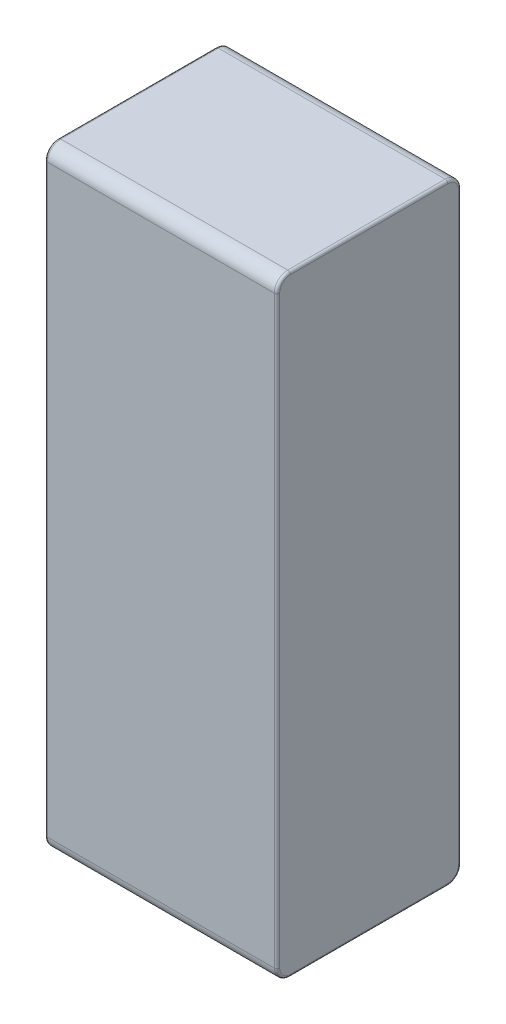
ISO-10303-21;
HEADER;
FILE_DESCRIPTION(('STEP AP214'),'2;1');
FILE_NAME('part.step','',(''),(''),'','','');
FILE_SCHEMA(('AUTOMOTIVE_DESIGN { 1 0 10303 214 1 1 1 1 }'));
ENDSEC;
DATA;
#1=APPLICATION_CONTEXT('core data for automotive mechanical design processes');
#2=APPLICATION_PROTOCOL_DEFINITION('international standard','automotive_design',2000,#1);
#3=PRODUCT_CONTEXT('',#1,'mechanical');
#4=PRODUCT('Part','Part','',(#3));
#5=PRODUCT_RELATED_PRODUCT_CATEGORY('part','',(#4));
#6=PRODUCT_DEFINITION_FORMATION('','',#4);
#7=PRODUCT_DEFINITION_CONTEXT('part definition',#1,'design');
#8=PRODUCT_DEFINITION('design','',#6,#7);
#9=PRODUCT_DEFINITION_SHAPE('','',#8);
#10=(LENGTH_UNIT() NAMED_UNIT(*) SI_UNIT(.MILLI.,.METRE.));
#11=(NAMED_UNIT(*) PLANE_ANGLE_UNIT() SI_UNIT($,.RADIAN.));
#12=(NAMED_UNIT(*) SI_UNIT($,.STERADIAN.) SOLID_ANGLE_UNIT());
#13=UNCERTAINTY_MEASURE_WITH_UNIT(LENGTH_MEASURE(1.E-05),#10,'distance_accuracy_value','');
#14=(GEOMETRIC_REPRESENTATION_CONTEXT(3) GLOBAL_UNCERTAINTY_ASSIGNED_CONTEXT((#13)) GLOBAL_UNIT_ASSIGNED_CONTEXT((#10,
#11,#12)) REPRESENTATION_CONTEXT('',''));
#15=CARTESIAN_POINT('',(0.,0.,0.));
#16=DIRECTION('',(0.,0.,1.));
#17=DIRECTION('',(1.,0.,0.));
#18=AXIS2_PLACEMENT_3D('',#15,#16,#17);
#19=CARTESIAN_POINT('',(-43.5,229.,34.5));
#20=DIRECTION('',(0.,0.,-1.));
#21=DIRECTION('',(-1.,0.,0.));
#22=AXIS2_PLACEMENT_3D('',#19,#20,#21);
#23=PLANE('',#22);
#24=DIRECTION('',(1.,0.,0.));
#25=VECTOR('',#24,1.);
#26=CARTESIAN_POINT('',(-43.5,5.,34.5));
#27=LINE('',#26,#25);
#28=CARTESIAN_POINT('',(-42.5,5.,34.5));
#29=VERTEX_POINT('',#28);
#30=CARTESIAN_POINT('',(42.5,5.,34.5));
#31=VERTEX_POINT('',#30);
#32=EDGE_CURVE('E150',#29,#31,#27,.T.);
#33=ORIENTED_EDGE('',*,*,#32,.T.);
#34=DIRECTION('',(0.,-1.,0.));
#35=VECTOR('',#34,1.);
#36=CARTESIAN_POINT('',(42.5,229.,34.5));
#37=LINE('',#36,#35);
#38=CARTESIAN_POINT('',(42.5,224.,34.5));
#39=VERTEX_POINT('',#38);
#40=EDGE_CURVE('E187',#31,#39,#37,.F.);
#41=ORIENTED_EDGE('',*,*,#40,.T.);
#42=DIRECTION('',(1.,0.,0.));
#43=VECTOR('',#42,1.);
#44=CARTESIAN_POINT('',(-42.5,224.,34.5));
#45=LINE('',#44,#43);
#46=CARTESIAN_POINT('',(-42.5,224.,34.5));
#47=VERTEX_POINT('',#46);
#48=EDGE_CURVE('E153',#39,#47,#45,.F.);
#49=ORIENTED_EDGE('',*,*,#48,.T.);
#50=DIRECTION('',(0.,-1.,0.));
#51=VECTOR('',#50,1.);
#52=CARTESIAN_POINT('',(-42.5,229.,34.5));
#53=LINE('',#52,#51);
#54=EDGE_CURVE('E136',#47,#29,#53,.T.);
#55=ORIENTED_EDGE('',*,*,#54,.T.);
#56=EDGE_LOOP('',(#33,#41,#49,#55));
#57=FACE_BOUND('',#56,.T.);
#58=ADVANCED_FACE('F18',(#57),#23,.F.);
#59=CARTESIAN_POINT('',(43.5,229.,34.5));
#60=DIRECTION('',(-1.,0.,0.));
#61=DIRECTION('',(0.,0.,1.));
#62=AXIS2_PLACEMENT_3D('',#59,#60,#61);
#63=PLANE('',#62);
#64=DIRECTION('',(0.,0.,-1.));
#65=VECTOR('',#64,1.);
#66=CARTESIAN_POINT('',(43.5,1.,34.5));
#67=LINE('',#66,#65);
#68=CARTESIAN_POINT('',(43.5,1.,29.5));
#69=VERTEX_POINT('',#68);
#70=CARTESIAN_POINT('',(43.5,1.,-29.5));
#71=VERTEX_POINT('',#70);
#72=EDGE_CURVE('E191',#69,#71,#67,.T.);
#73=ORIENTED_EDGE('',*,*,#72,.T.);
#74=CARTESIAN_POINT('',(43.5,5.,-29.5));
#75=DIRECTION('',(-1.,0.,0.));
#76=DIRECTION('',(0.,0.,1.));
#77=AXIS2_PLACEMENT_3D('',#74,#75,#76);
#78=CIRCLE('',#77,4.);
#79=CARTESIAN_POINT('',(43.5,5.,-33.5));
#80=VERTEX_POINT('',#79);
#81=EDGE_CURVE('E230',#71,#80,#78,.F.);
#82=ORIENTED_EDGE('',*,*,#81,.T.);
#83=DIRECTION('',(0.,-1.,0.));
#84=VECTOR('',#83,1.);
#85=CARTESIAN_POINT('',(43.5,229.,-33.5));
#86=LINE('',#85,#84);
#87=CARTESIAN_POINT('',(43.5,224.,-33.5));
#88=VERTEX_POINT('',#87);
#89=EDGE_CURVE('E218',#80,#88,#86,.F.);
#90=ORIENTED_EDGE('',*,*,#89,.T.);
#91=CARTESIAN_POINT('',(43.5,224.,-29.5));
#92=DIRECTION('',(-1.,0.,0.));
#93=DIRECTION('',(0.,0.,1.));
#94=AXIS2_PLACEMENT_3D('',#91,#92,#93);
#95=CIRCLE('',#94,4.);
#96=CARTESIAN_POINT('',(43.5,228.,-29.5));
#97=VERTEX_POINT('',#96);
#98=EDGE_CURVE('E220',#88,#97,#95,.F.);
#99=ORIENTED_EDGE('',*,*,#98,.T.);
#100=DIRECTION('',(0.,0.,-1.));
#101=VECTOR('',#100,1.);
#102=CARTESIAN_POINT('',(43.5,228.,29.5));
#103=LINE('',#102,#101);
#104=CARTESIAN_POINT('',(43.5,228.,29.5));
#105=VERTEX_POINT('',#104);
#106=EDGE_CURVE('E207',#97,#105,#103,.F.);
#107=ORIENTED_EDGE('',*,*,#106,.T.);
#108=CARTESIAN_POINT('',(43.5,224.,29.5));
#109=DIRECTION('',(-1.,0.,0.));
#110=DIRECTION('',(0.,0.,1.));
#111=AXIS2_PLACEMENT_3D('',#108,#109,#110);
#112=CIRCLE('',#111,4.);
#113=CARTESIAN_POINT('',(43.5,224.,33.5));
#114=VERTEX_POINT('',#113);
#115=EDGE_CURVE('E205',#105,#114,#112,.F.);
#116=ORIENTED_EDGE('',*,*,#115,.T.);
#117=DIRECTION('',(0.,-1.,0.));
#118=VECTOR('',#117,1.);
#119=CARTESIAN_POINT('',(43.5,229.,33.5));
#120=LINE('',#119,#118);
#121=CARTESIAN_POINT('',(43.5,5.,33.5));
#122=VERTEX_POINT('',#121);
#123=EDGE_CURVE('E180',#114,#122,#120,.T.);
#124=ORIENTED_EDGE('',*,*,#123,.T.);
#125=CARTESIAN_POINT('',(43.5,5.,29.5));
#126=DIRECTION('',(-1.,0.,0.));
#127=DIRECTION('',(0.,0.,1.));
#128=AXIS2_PLACEMENT_3D('',#125,#126,#127);
#129=CIRCLE('',#128,4.);
#130=EDGE_CURVE('E189',#122,#69,#129,.F.);
#131=ORIENTED_EDGE('',*,*,#130,.T.);
#132=EDGE_LOOP('',(#73,#82,#90,#99,#107,#116,#124,#131));
#133=FACE_BOUND('',#132,.T.);
#134=ADVANCED_FACE('F248',(#133),#63,.F.);
#135=CARTESIAN_POINT('',(43.5,229.,-34.5));
#136=DIRECTION('',(0.,0.,1.));
#137=DIRECTION('',(1.,0.,0.));
#138=AXIS2_PLACEMENT_3D('',#135,#136,#137);
#139=PLANE('',#138);
#140=DIRECTION('',(-1.,0.,0.));
#141=VECTOR('',#140,1.);
#142=CARTESIAN_POINT('',(43.5,224.,-34.5));
#143=LINE('',#142,#141);
#144=CARTESIAN_POINT('',(-42.5,224.,-34.5));
#145=VERTEX_POINT('',#144);
#146=CARTESIAN_POINT('',(42.5,224.,-34.5));
#147=VERTEX_POINT('',#146);
#148=EDGE_CURVE('E390',#145,#147,#143,.F.);
#149=ORIENTED_EDGE('',*,*,#148,.T.);
#150=DIRECTION('',(0.,-1.,0.));
#151=VECTOR('',#150,1.);
#152=CARTESIAN_POINT('',(42.5,229.,-34.5));
#153=LINE('',#152,#151);
#154=CARTESIAN_POINT('',(42.5,5.,-34.5));
#155=VERTEX_POINT('',#154);
#156=EDGE_CURVE('E213',#147,#155,#153,.T.);
#157=ORIENTED_EDGE('',*,*,#156,.T.);
#158=DIRECTION('',(-1.,0.,0.));
#159=VECTOR('',#158,1.);
#160=CARTESIAN_POINT('',(43.5,5.,-34.5));
#161=LINE('',#160,#159);
#162=CARTESIAN_POINT('',(-42.5,5.,-34.5));
#163=VERTEX_POINT('',#162);
#164=EDGE_CURVE('E239',#155,#163,#161,.T.);
#165=ORIENTED_EDGE('',*,*,#164,.T.);
#166=DIRECTION('',(0.,-1.,0.));
#167=VECTOR('',#166,1.);
#168=CARTESIAN_POINT('',(-42.5,229.,-34.5));
#169=LINE('',#168,#167);
#170=EDGE_CURVE('E344',#163,#145,#169,.F.);
#171=ORIENTED_EDGE('',*,*,#170,.T.);
#172=EDGE_LOOP('',(#149,#157,#165,#171));
#173=FACE_BOUND('',#172,.T.);
#174=ADVANCED_FACE('F289',(#173),#139,.F.);
#175=CARTESIAN_POINT('',(-43.5,229.,-34.5));
#176=DIRECTION('',(1.,0.,0.));
#177=DIRECTION('',(0.,0.,-1.));
#178=AXIS2_PLACEMENT_3D('',#175,#176,#177);
#179=PLANE('',#178);
#180=DIRECTION('',(0.,0.,1.));
#181=VECTOR('',#180,1.);
#182=CARTESIAN_POINT('',(-43.5,1.,-34.5));
#183=LINE('',#182,#181);
#184=CARTESIAN_POINT('',(-43.5,1.,-29.5));
#185=VERTEX_POINT('',#184);
#186=CARTESIAN_POINT('',(-43.5,1.,29.5));
#187=VERTEX_POINT('',#186);
#188=EDGE_CURVE('E362',#185,#187,#183,.T.);
#189=ORIENTED_EDGE('',*,*,#188,.T.);
#190=CARTESIAN_POINT('',(-43.5,5.,29.5));
#191=DIRECTION('',(1.,0.,0.));
#192=DIRECTION('',(0.,0.,-1.));
#193=AXIS2_PLACEMENT_3D('',#190,#191,#192);
#194=CIRCLE('',#193,4.);
#195=CARTESIAN_POINT('',(-43.5,5.,33.5));
#196=VERTEX_POINT('',#195);
#197=EDGE_CURVE('E144',#187,#196,#194,.F.);
#198=ORIENTED_EDGE('',*,*,#197,.T.);
#199=DIRECTION('',(0.,-1.,0.));
#200=VECTOR('',#199,1.);
#201=CARTESIAN_POINT('',(-43.5,229.,33.5));
#202=LINE('',#201,#200);
#203=CARTESIAN_POINT('',(-43.5,224.,33.5));
#204=VERTEX_POINT('',#203);
#205=EDGE_CURVE('E138',#196,#204,#202,.F.);
#206=ORIENTED_EDGE('',*,*,#205,.T.);
#207=CARTESIAN_POINT('',(-43.5,224.,29.5));
#208=DIRECTION('',(1.,0.,0.));
#209=DIRECTION('',(0.,0.,-1.));
#210=AXIS2_PLACEMENT_3D('',#207,#208,#209);
#211=CIRCLE('',#210,4.);
#212=CARTESIAN_POINT('',(-43.5,228.,29.5));
#213=VERTEX_POINT('',#212);
#214=EDGE_CURVE('E368',#204,#213,#211,.F.);
#215=ORIENTED_EDGE('',*,*,#214,.T.);
#216=DIRECTION('',(0.,0.,1.));
#217=VECTOR('',#216,1.);
#218=CARTESIAN_POINT('',(-43.5,228.,-29.5));
#219=LINE('',#218,#217);
#220=CARTESIAN_POINT('',(-43.5,228.,-29.5));
#221=VERTEX_POINT('',#220);
#222=EDGE_CURVE('E375',#213,#221,#219,.F.);
#223=ORIENTED_EDGE('',*,*,#222,.T.);
#224=CARTESIAN_POINT('',(-43.5,224.,-29.5));
#225=DIRECTION('',(1.,0.,0.));
#226=DIRECTION('',(0.,0.,-1.));
#227=AXIS2_PLACEMENT_3D('',#224,#225,#226);
#228=CIRCLE('',#227,4.);
#229=CARTESIAN_POINT('',(-43.5,224.,-33.5));
#230=VERTEX_POINT('',#229);
#231=EDGE_CURVE('E349',#221,#230,#228,.F.);
#232=ORIENTED_EDGE('',*,*,#231,.T.);
#233=DIRECTION('',(0.,-1.,0.));
#234=VECTOR('',#233,1.);
#235=CARTESIAN_POINT('',(-43.5,229.,-33.5));
#236=LINE('',#235,#234);
#237=CARTESIAN_POINT('',(-43.5,5.,-33.5));
#238=VERTEX_POINT('',#237);
#239=EDGE_CURVE('E343',#230,#238,#236,.T.);
#240=ORIENTED_EDGE('',*,*,#239,.T.);
#241=CARTESIAN_POINT('',(-43.5,5.,-29.5));
#242=DIRECTION('',(1.,0.,0.));
#243=DIRECTION('',(0.,0.,-1.));
#244=AXIS2_PLACEMENT_3D('',#241,#242,#243);
#245=CIRCLE('',#244,4.);
#246=EDGE_CURVE('E338',#238,#185,#245,.F.);
#247=ORIENTED_EDGE('',*,*,#246,.T.);
#248=EDGE_LOOP('',(#189,#198,#206,#215,#223,#232,#240,#247));
#249=FACE_BOUND('',#248,.T.);
#250=ADVANCED_FACE('F346',(#249),#179,.F.);
#251=CARTESIAN_POINT('',(0.,229.,0.));
#252=DIRECTION('',(0.,1.,0.));
#253=DIRECTION('',(0.,0.,1.));
#254=AXIS2_PLACEMENT_3D('',#251,#252,#253);
#255=PLANE('',#254);
#256=DIRECTION('',(1.,0.,0.));
#257=VECTOR('',#256,1.);
#258=CARTESIAN_POINT('',(43.5,229.,29.5));
#259=LINE('',#258,#257);
#260=CARTESIAN_POINT('',(-42.5,229.,29.5));
#261=VERTEX_POINT('',#260);
#262=CARTESIAN_POINT('',(42.5,229.,29.5));
#263=VERTEX_POINT('',#262);
#264=EDGE_CURVE('E242',#261,#263,#259,.T.);
#265=ORIENTED_EDGE('',*,*,#264,.T.);
#266=DIRECTION('',(0.,0.,-1.));
#267=VECTOR('',#266,1.);
#268=CARTESIAN_POINT('',(42.5,229.,-29.5));
#269=LINE('',#268,#267);
#270=CARTESIAN_POINT('',(42.5,229.,-29.5));
#271=VERTEX_POINT('',#270);
#272=EDGE_CURVE('E199',#263,#271,#269,.T.);
#273=ORIENTED_EDGE('',*,*,#272,.T.);
#274=DIRECTION('',(-1.,0.,0.));
#275=VECTOR('',#274,1.);
#276=CARTESIAN_POINT('',(-43.5,229.,-29.5));
#277=LINE('',#276,#275);
#278=CARTESIAN_POINT('',(-42.5,229.,-29.5));
#279=VERTEX_POINT('',#278);
#280=EDGE_CURVE('E389',#271,#279,#277,.T.);
#281=ORIENTED_EDGE('',*,*,#280,.T.);
#282=DIRECTION('',(0.,0.,1.));
#283=VECTOR('',#282,1.);
#284=CARTESIAN_POINT('',(-42.5,229.,29.5));
#285=LINE('',#284,#283);
#286=EDGE_CURVE('E378',#279,#261,#285,.T.);
#287=ORIENTED_EDGE('',*,*,#286,.T.);
#288=EDGE_LOOP('',(#265,#273,#281,#287));
#289=FACE_BOUND('',#288,.T.);
#290=ADVANCED_FACE('F387',(#289),#255,.T.);
#291=CARTESIAN_POINT('',(0.,0.,0.));
#292=DIRECTION('',(0.,1.,0.));
#293=DIRECTION('',(0.,0.,1.));
#294=AXIS2_PLACEMENT_3D('',#291,#292,#293);
#295=PLANE('',#294);
#296=DIRECTION('',(-1.,0.,0.));
#297=VECTOR('',#296,1.);
#298=CARTESIAN_POINT('',(0.,0.,-29.5));
#299=LINE('',#298,#297);
#300=CARTESIAN_POINT('',(-42.5,0.,-29.5));
#301=VERTEX_POINT('',#300);
#302=CARTESIAN_POINT('',(42.5,0.,-29.5));
#303=VERTEX_POINT('',#302);
#304=EDGE_CURVE('E237',#301,#303,#299,.F.);
#305=ORIENTED_EDGE('',*,*,#304,.T.);
#306=DIRECTION('',(0.,0.,-1.));
#307=VECTOR('',#306,1.);
#308=CARTESIAN_POINT('',(42.5,0.,0.));
#309=LINE('',#308,#307);
#310=CARTESIAN_POINT('',(42.5,0.,29.5));
#311=VERTEX_POINT('',#310);
#312=EDGE_CURVE('E193',#303,#311,#309,.F.);
#313=ORIENTED_EDGE('',*,*,#312,.T.);
#314=DIRECTION('',(1.,0.,0.));
#315=VECTOR('',#314,1.);
#316=CARTESIAN_POINT('',(0.,0.,29.5));
#317=LINE('',#316,#315);
#318=CARTESIAN_POINT('',(-42.5,0.,29.5));
#319=VERTEX_POINT('',#318);
#320=EDGE_CURVE('E164',#311,#319,#317,.F.);
#321=ORIENTED_EDGE('',*,*,#320,.T.);
#322=DIRECTION('',(0.,0.,1.));
#323=VECTOR('',#322,1.);
#324=CARTESIAN_POINT('',(-42.5,0.,0.));
#325=LINE('',#324,#323);
#326=EDGE_CURVE('E178',#319,#301,#325,.F.);
#327=ORIENTED_EDGE('',*,*,#326,.T.);
#328=EDGE_LOOP('',(#305,#313,#321,#327));
#329=FACE_BOUND('',#328,.T.);
#330=ADVANCED_FACE('F241',(#329),#295,.F.);
#331=CARTESIAN_POINT('',(-42.5,229.,33.5));
#332=DIRECTION('',(0.,-1.,0.));
#333=DIRECTION('',(0.,0.,-1.));
#334=AXIS2_PLACEMENT_3D('',#331,#332,#333);
#335=CYLINDRICAL_SURFACE('',#334,1.);
#336=ORIENTED_EDGE('',*,*,#205,.F.);
#337=CARTESIAN_POINT('',(-42.5,5.,33.5));
#338=DIRECTION('',(0.,-1.,0.));
#339=DIRECTION('',(0.,0.,-1.));
#340=AXIS2_PLACEMENT_3D('',#337,#338,#339);
#341=CIRCLE('',#340,1.);
#342=EDGE_CURVE('E132',#196,#29,#341,.F.);
#343=ORIENTED_EDGE('',*,*,#342,.T.);
#344=ORIENTED_EDGE('',*,*,#54,.F.);
#345=CARTESIAN_POINT('',(-42.5,224.,33.5));
#346=DIRECTION('',(0.,-1.,0.));
#347=DIRECTION('',(0.,0.,-1.));
#348=AXIS2_PLACEMENT_3D('',#345,#346,#347);
#349=CIRCLE('',#348,1.);
#350=EDGE_CURVE('E371',#47,#204,#349,.T.);
#351=ORIENTED_EDGE('',*,*,#350,.T.);
#352=EDGE_LOOP('',(#336,#343,#344,#351));
#353=FACE_BOUND('',#352,.T.);
#354=ADVANCED_FACE('F134',(#353),#335,.T.);
#355=CARTESIAN_POINT('',(-43.5,5.,29.5));
#356=DIRECTION('',(1.,0.,0.));
#357=DIRECTION('',(0.,0.,-1.));
#358=AXIS2_PLACEMENT_3D('',#355,#356,#357);
#359=CYLINDRICAL_SURFACE('',#358,5.);
#360=ORIENTED_EDGE('',*,*,#320,.F.);
#361=CARTESIAN_POINT('',(42.5,5.,29.5));
#362=DIRECTION('',(-1.,0.,0.));
#363=DIRECTION('',(0.,0.,1.));
#364=AXIS2_PLACEMENT_3D('',#361,#362,#363);
#365=CIRCLE('',#364,5.);
#366=EDGE_CURVE('E163',#311,#31,#365,.T.);
#367=ORIENTED_EDGE('',*,*,#366,.T.);
#368=ORIENTED_EDGE('',*,*,#32,.F.);
#369=CARTESIAN_POINT('',(-42.5,5.,29.5));
#370=DIRECTION('',(1.,0.,0.));
#371=DIRECTION('',(0.,0.,-1.));
#372=AXIS2_PLACEMENT_3D('',#369,#370,#371);
#373=CIRCLE('',#372,5.);
#374=EDGE_CURVE('E143',#29,#319,#373,.T.);
#375=ORIENTED_EDGE('',*,*,#374,.T.);
#376=EDGE_LOOP('',(#360,#367,#368,#375));
#377=FACE_BOUND('',#376,.T.);
#378=ADVANCED_FACE('F160',(#377),#359,.T.);
#379=CARTESIAN_POINT('',(43.5,5.,-29.5));
#380=DIRECTION('',(-1.,0.,0.));
#381=DIRECTION('',(0.,0.,1.));
#382=AXIS2_PLACEMENT_3D('',#379,#380,#381);
#383=CYLINDRICAL_SURFACE('',#382,5.);
#384=ORIENTED_EDGE('',*,*,#164,.F.);
#385=CARTESIAN_POINT('',(42.5,5.,-29.5));
#386=DIRECTION('',(-1.,0.,0.));
#387=DIRECTION('',(0.,0.,1.));
#388=AXIS2_PLACEMENT_3D('',#385,#386,#387);
#389=CIRCLE('',#388,5.);
#390=EDGE_CURVE('E26',#155,#303,#389,.T.);
#391=ORIENTED_EDGE('',*,*,#390,.T.);
#392=ORIENTED_EDGE('',*,*,#304,.F.);
#393=CARTESIAN_POINT('',(-42.5,5.,-29.5));
#394=DIRECTION('',(1.,0.,0.));
#395=DIRECTION('',(0.,0.,-1.));
#396=AXIS2_PLACEMENT_3D('',#393,#394,#395);
#397=CIRCLE('',#396,5.);
#398=EDGE_CURVE('E170',#301,#163,#397,.T.);
#399=ORIENTED_EDGE('',*,*,#398,.T.);
#400=EDGE_LOOP('',(#384,#391,#392,#399));
#401=FACE_BOUND('',#400,.T.);
#402=ADVANCED_FACE('F236',(#401),#383,.T.);
#403=CARTESIAN_POINT('',(0.,224.,29.5));
#404=DIRECTION('',(-1.,0.,0.));
#405=DIRECTION('',(0.,0.,1.));
#406=AXIS2_PLACEMENT_3D('',#403,#404,#405);
#407=CYLINDRICAL_SURFACE('',#406,5.);
#408=ORIENTED_EDGE('',*,*,#48,.F.);
#409=CARTESIAN_POINT('',(42.5,224.,29.5));
#410=DIRECTION('',(-1.,0.,0.));
#411=DIRECTION('',(0.,0.,1.));
#412=AXIS2_PLACEMENT_3D('',#409,#410,#411);
#413=CIRCLE('',#412,5.);
#414=EDGE_CURVE('E211',#39,#263,#413,.T.);
#415=ORIENTED_EDGE('',*,*,#414,.T.);
#416=ORIENTED_EDGE('',*,*,#264,.F.);
#417=CARTESIAN_POINT('',(-42.5,224.,29.5));
#418=DIRECTION('',(1.,0.,0.));
#419=DIRECTION('',(0.,0.,-1.));
#420=AXIS2_PLACEMENT_3D('',#417,#418,#419);
#421=CIRCLE('',#420,5.);
#422=EDGE_CURVE('E373',#261,#47,#421,.T.);
#423=ORIENTED_EDGE('',*,*,#422,.T.);
#424=EDGE_LOOP('',(#408,#415,#416,#423));
#425=FACE_BOUND('',#424,.T.);
#426=ADVANCED_FACE('F299',(#425),#407,.T.);
#427=CARTESIAN_POINT('',(0.,224.,-29.5));
#428=DIRECTION('',(1.,0.,0.));
#429=DIRECTION('',(0.,0.,-1.));
#430=AXIS2_PLACEMENT_3D('',#427,#428,#429);
#431=CYLINDRICAL_SURFACE('',#430,5.);
#432=ORIENTED_EDGE('',*,*,#280,.F.);
#433=CARTESIAN_POINT('',(42.5,224.,-29.5));
#434=DIRECTION('',(-1.,0.,0.));
#435=DIRECTION('',(0.,0.,1.));
#436=AXIS2_PLACEMENT_3D('',#433,#434,#435);
#437=CIRCLE('',#436,5.);
#438=EDGE_CURVE('E223',#271,#147,#437,.T.);
#439=ORIENTED_EDGE('',*,*,#438,.T.);
#440=ORIENTED_EDGE('',*,*,#148,.F.);
#441=CARTESIAN_POINT('',(-42.5,224.,-29.5));
#442=DIRECTION('',(1.,0.,0.));
#443=DIRECTION('',(0.,0.,-1.));
#444=AXIS2_PLACEMENT_3D('',#441,#442,#443);
#445=CIRCLE('',#444,5.);
#446=EDGE_CURVE('E352',#145,#279,#445,.T.);
#447=ORIENTED_EDGE('',*,*,#446,.T.);
#448=EDGE_LOOP('',(#432,#439,#440,#447));
#449=FACE_BOUND('',#448,.T.);
#450=ADVANCED_FACE('F302',(#449),#431,.T.);
#451=CARTESIAN_POINT('',(-42.5,228.,0.));
#452=DIRECTION('',(0.,0.,-1.));
#453=DIRECTION('',(-1.,0.,0.));
#454=AXIS2_PLACEMENT_3D('',#451,#452,#453);
#455=CYLINDRICAL_SURFACE('',#454,1.);
#456=ORIENTED_EDGE('',*,*,#286,.F.);
#457=CARTESIAN_POINT('',(-42.5,228.,-29.5));
#458=DIRECTION('',(0.,0.,-1.));
#459=DIRECTION('',(-1.,0.,0.));
#460=AXIS2_PLACEMENT_3D('',#457,#458,#459);
#461=CIRCLE('',#460,1.);
#462=EDGE_CURVE('E360',#279,#221,#461,.F.);
#463=ORIENTED_EDGE('',*,*,#462,.T.);
#464=ORIENTED_EDGE('',*,*,#222,.F.);
#465=CARTESIAN_POINT('',(-42.5,228.,29.5));
#466=DIRECTION('',(0.,0.,-1.));
#467=DIRECTION('',(-1.,0.,0.));
#468=AXIS2_PLACEMENT_3D('',#465,#466,#467);
#469=CIRCLE('',#468,1.);
#470=EDGE_CURVE('E354',#213,#261,#469,.T.);
#471=ORIENTED_EDGE('',*,*,#470,.T.);
#472=EDGE_LOOP('',(#456,#463,#464,#471));
#473=FACE_BOUND('',#472,.T.);
#474=ADVANCED_FACE('F306',(#473),#455,.T.);
#475=CARTESIAN_POINT('',(-42.5,224.,29.5));
#476=DIRECTION('',(1.,0.,0.));
#477=DIRECTION('',(0.,0.,-1.));
#478=AXIS2_PLACEMENT_3D('',#475,#476,#477);
#479=TOROIDAL_SURFACE('',#478,4.,1.);
#480=ORIENTED_EDGE('',*,*,#350,.F.);
#481=ORIENTED_EDGE('',*,*,#422,.F.);
#482=ORIENTED_EDGE('',*,*,#470,.F.);
#483=ORIENTED_EDGE('',*,*,#214,.F.);
#484=EDGE_LOOP('',(#480,#481,#482,#483));
#485=FACE_BOUND('',#484,.T.);
#486=ADVANCED_FACE('F310',(#485),#479,.T.);
#487=CARTESIAN_POINT('',(-42.5,224.,-29.5));
#488=DIRECTION('',(1.,0.,0.));
#489=DIRECTION('',(0.,0.,-1.));
#490=AXIS2_PLACEMENT_3D('',#487,#488,#489);
#491=TOROIDAL_SURFACE('',#490,4.,1.);
#492=ORIENTED_EDGE('',*,*,#462,.F.);
#493=ORIENTED_EDGE('',*,*,#446,.F.);
#494=CARTESIAN_POINT('',(-42.5,224.,-33.5));
#495=DIRECTION('',(0.,-1.,0.));
#496=DIRECTION('',(0.,0.,-1.));
#497=AXIS2_PLACEMENT_3D('',#494,#495,#496);
#498=CIRCLE('',#497,1.);
#499=EDGE_CURVE('E155',#230,#145,#498,.T.);
#500=ORIENTED_EDGE('',*,*,#499,.F.);
#501=ORIENTED_EDGE('',*,*,#231,.F.);
#502=EDGE_LOOP('',(#492,#493,#500,#501));
#503=FACE_BOUND('',#502,.T.);
#504=ADVANCED_FACE('F314',(#503),#491,.T.);
#505=CARTESIAN_POINT('',(-42.5,229.,-33.5));
#506=DIRECTION('',(0.,-1.,0.));
#507=DIRECTION('',(0.,0.,-1.));
#508=AXIS2_PLACEMENT_3D('',#505,#506,#507);
#509=CYLINDRICAL_SURFACE('',#508,1.);
#510=ORIENTED_EDGE('',*,*,#170,.F.);
#511=CARTESIAN_POINT('',(-42.5,5.,-33.5));
#512=DIRECTION('',(0.,-1.,0.));
#513=DIRECTION('',(0.,0.,-1.));
#514=AXIS2_PLACEMENT_3D('',#511,#512,#513);
#515=CIRCLE('',#514,1.);
#516=EDGE_CURVE('E173',#163,#238,#515,.F.);
#517=ORIENTED_EDGE('',*,*,#516,.T.);
#518=ORIENTED_EDGE('',*,*,#239,.F.);
#519=ORIENTED_EDGE('',*,*,#499,.T.);
#520=EDGE_LOOP('',(#510,#517,#518,#519));
#521=FACE_BOUND('',#520,.T.);
#522=ADVANCED_FACE('F316',(#521),#509,.T.);
#523=CARTESIAN_POINT('',(-42.5,5.,-29.5));
#524=DIRECTION('',(1.,0.,0.));
#525=DIRECTION('',(0.,0.,-1.));
#526=AXIS2_PLACEMENT_3D('',#523,#524,#525);
#527=TOROIDAL_SURFACE('',#526,4.,1.);
#528=ORIENTED_EDGE('',*,*,#516,.F.);
#529=ORIENTED_EDGE('',*,*,#398,.F.);
#530=CARTESIAN_POINT('',(-42.5,1.,-29.5));
#531=DIRECTION('',(0.,0.,1.));
#532=DIRECTION('',(1.,0.,0.));
#533=AXIS2_PLACEMENT_3D('',#530,#531,#532);
#534=CIRCLE('',#533,1.);
#535=EDGE_CURVE('E182',#185,#301,#534,.T.);
#536=ORIENTED_EDGE('',*,*,#535,.F.);
#537=ORIENTED_EDGE('',*,*,#246,.F.);
#538=EDGE_LOOP('',(#528,#529,#536,#537));
#539=FACE_BOUND('',#538,.T.);
#540=ADVANCED_FACE('F319',(#539),#527,.T.);
#541=CARTESIAN_POINT('',(-42.5,1.,-34.5));
#542=DIRECTION('',(0.,0.,1.));
#543=DIRECTION('',(1.,0.,0.));
#544=AXIS2_PLACEMENT_3D('',#541,#542,#543);
#545=CYLINDRICAL_SURFACE('',#544,1.);
#546=ORIENTED_EDGE('',*,*,#535,.T.);
#547=ORIENTED_EDGE('',*,*,#326,.F.);
#548=CARTESIAN_POINT('',(-42.5,1.,29.5));
#549=DIRECTION('',(0.,0.,1.));
#550=DIRECTION('',(1.,0.,0.));
#551=AXIS2_PLACEMENT_3D('',#548,#549,#550);
#552=CIRCLE('',#551,1.);
#553=EDGE_CURVE('E169',#187,#319,#552,.T.);
#554=ORIENTED_EDGE('',*,*,#553,.F.);
#555=ORIENTED_EDGE('',*,*,#188,.F.);
#556=EDGE_LOOP('',(#546,#547,#554,#555));
#557=FACE_BOUND('',#556,.T.);
#558=ADVANCED_FACE('F326',(#557),#545,.T.);
#559=CARTESIAN_POINT('',(-42.5,5.,29.5));
#560=DIRECTION('',(1.,0.,0.));
#561=DIRECTION('',(0.,0.,-1.));
#562=AXIS2_PLACEMENT_3D('',#559,#560,#561);
#563=TOROIDAL_SURFACE('',#562,4.,1.);
#564=ORIENTED_EDGE('',*,*,#553,.T.);
#565=ORIENTED_EDGE('',*,*,#374,.F.);
#566=ORIENTED_EDGE('',*,*,#342,.F.);
#567=ORIENTED_EDGE('',*,*,#197,.F.);
#568=EDGE_LOOP('',(#564,#565,#566,#567));
#569=FACE_BOUND('',#568,.T.);
#570=ADVANCED_FACE('F167',(#569),#563,.T.);
#571=CARTESIAN_POINT('',(42.5,229.,33.5));
#572=DIRECTION('',(0.,-1.,0.));
#573=DIRECTION('',(0.,0.,-1.));
#574=AXIS2_PLACEMENT_3D('',#571,#572,#573);
#575=CYLINDRICAL_SURFACE('',#574,1.);
#576=ORIENTED_EDGE('',*,*,#123,.F.);
#577=CARTESIAN_POINT('',(42.5,224.,33.5));
#578=DIRECTION('',(0.,-1.,0.));
#579=DIRECTION('',(0.,0.,-1.));
#580=AXIS2_PLACEMENT_3D('',#577,#578,#579);
#581=CIRCLE('',#580,1.);
#582=EDGE_CURVE('E209',#114,#39,#581,.T.);
#583=ORIENTED_EDGE('',*,*,#582,.T.);
#584=ORIENTED_EDGE('',*,*,#40,.F.);
#585=CARTESIAN_POINT('',(42.5,5.,33.5));
#586=DIRECTION('',(0.,-1.,0.));
#587=DIRECTION('',(0.,0.,-1.));
#588=AXIS2_PLACEMENT_3D('',#585,#586,#587);
#589=CIRCLE('',#588,1.);
#590=EDGE_CURVE('E196',#31,#122,#589,.F.);
#591=ORIENTED_EDGE('',*,*,#590,.T.);
#592=EDGE_LOOP('',(#576,#583,#584,#591));
#593=FACE_BOUND('',#592,.T.);
#594=ADVANCED_FACE('F269',(#593),#575,.T.);
#595=CARTESIAN_POINT('',(42.5,5.,29.5));
#596=DIRECTION('',(-1.,0.,0.));
#597=DIRECTION('',(0.,0.,1.));
#598=AXIS2_PLACEMENT_3D('',#595,#596,#597);
#599=TOROIDAL_SURFACE('',#598,4.,1.);
#600=ORIENTED_EDGE('',*,*,#590,.F.);
#601=ORIENTED_EDGE('',*,*,#366,.F.);
#602=CARTESIAN_POINT('',(42.5,1.,29.5));
#603=DIRECTION('',(0.,0.,-1.));
#604=DIRECTION('',(-1.,0.,0.));
#605=AXIS2_PLACEMENT_3D('',#602,#603,#604);
#606=CIRCLE('',#605,1.);
#607=EDGE_CURVE('E183',#69,#311,#606,.T.);
#608=ORIENTED_EDGE('',*,*,#607,.F.);
#609=ORIENTED_EDGE('',*,*,#130,.F.);
#610=EDGE_LOOP('',(#600,#601,#608,#609));
#611=FACE_BOUND('',#610,.T.);
#612=ADVANCED_FACE('F273',(#611),#599,.T.);
#613=CARTESIAN_POINT('',(42.5,1.,34.5));
#614=DIRECTION('',(0.,0.,-1.));
#615=DIRECTION('',(-1.,0.,0.));
#616=AXIS2_PLACEMENT_3D('',#613,#614,#615);
#617=CYLINDRICAL_SURFACE('',#616,1.);
#618=ORIENTED_EDGE('',*,*,#312,.F.);
#619=CARTESIAN_POINT('',(42.5,1.,-29.5));
#620=DIRECTION('',(0.,0.,-1.));
#621=DIRECTION('',(-1.,0.,0.));
#622=AXIS2_PLACEMENT_3D('',#619,#620,#621);
#623=CIRCLE('',#622,1.);
#624=EDGE_CURVE('E11',#303,#71,#623,.F.);
#625=ORIENTED_EDGE('',*,*,#624,.T.);
#626=ORIENTED_EDGE('',*,*,#72,.F.);
#627=ORIENTED_EDGE('',*,*,#607,.T.);
#628=EDGE_LOOP('',(#618,#625,#626,#627));
#629=FACE_BOUND('',#628,.T.);
#630=ADVANCED_FACE('F244',(#629),#617,.T.);
#631=CARTESIAN_POINT('',(42.5,224.,29.5));
#632=DIRECTION('',(-1.,0.,0.));
#633=DIRECTION('',(0.,0.,1.));
#634=AXIS2_PLACEMENT_3D('',#631,#632,#633);
#635=TOROIDAL_SURFACE('',#634,4.,1.);
#636=ORIENTED_EDGE('',*,*,#582,.F.);
#637=ORIENTED_EDGE('',*,*,#115,.F.);
#638=CARTESIAN_POINT('',(42.5,228.,29.5));
#639=DIRECTION('',(0.,0.,-1.));
#640=DIRECTION('',(-1.,0.,0.));
#641=AXIS2_PLACEMENT_3D('',#638,#639,#640);
#642=CIRCLE('',#641,1.);
#643=EDGE_CURVE('E202',#263,#105,#642,.T.);
#644=ORIENTED_EDGE('',*,*,#643,.F.);
#645=ORIENTED_EDGE('',*,*,#414,.F.);
#646=EDGE_LOOP('',(#636,#637,#644,#645));
#647=FACE_BOUND('',#646,.T.);
#648=ADVANCED_FACE('F266',(#647),#635,.T.);
#649=CARTESIAN_POINT('',(42.5,228.,0.));
#650=DIRECTION('',(0.,0.,1.));
#651=DIRECTION('',(1.,0.,0.));
#652=AXIS2_PLACEMENT_3D('',#649,#650,#651);
#653=CYLINDRICAL_SURFACE('',#652,1.);
#654=ORIENTED_EDGE('',*,*,#106,.F.);
#655=CARTESIAN_POINT('',(42.5,228.,-29.5));
#656=DIRECTION('',(0.,0.,1.));
#657=DIRECTION('',(1.,0.,0.));
#658=AXIS2_PLACEMENT_3D('',#655,#656,#657);
#659=CIRCLE('',#658,1.);
#660=EDGE_CURVE('E228',#97,#271,#659,.T.);
#661=ORIENTED_EDGE('',*,*,#660,.T.);
#662=ORIENTED_EDGE('',*,*,#272,.F.);
#663=ORIENTED_EDGE('',*,*,#643,.T.);
#664=EDGE_LOOP('',(#654,#661,#662,#663));
#665=FACE_BOUND('',#664,.T.);
#666=ADVANCED_FACE('F260',(#665),#653,.T.);
#667=CARTESIAN_POINT('',(42.5,229.,-33.5));
#668=DIRECTION('',(0.,-1.,0.));
#669=DIRECTION('',(0.,0.,-1.));
#670=AXIS2_PLACEMENT_3D('',#667,#668,#669);
#671=CYLINDRICAL_SURFACE('',#670,1.);
#672=ORIENTED_EDGE('',*,*,#89,.F.);
#673=CARTESIAN_POINT('',(42.5,5.,-33.5));
#674=DIRECTION('',(0.,-1.,0.));
#675=DIRECTION('',(0.,0.,-1.));
#676=AXIS2_PLACEMENT_3D('',#673,#674,#675);
#677=CIRCLE('',#676,1.);
#678=EDGE_CURVE('E39',#80,#155,#677,.F.);
#679=ORIENTED_EDGE('',*,*,#678,.T.);
#680=ORIENTED_EDGE('',*,*,#156,.F.);
#681=CARTESIAN_POINT('',(42.5,224.,-33.5));
#682=DIRECTION('',(0.,-1.,0.));
#683=DIRECTION('',(0.,0.,-1.));
#684=AXIS2_PLACEMENT_3D('',#681,#682,#683);
#685=CIRCLE('',#684,1.);
#686=EDGE_CURVE('E225',#147,#88,#685,.T.);
#687=ORIENTED_EDGE('',*,*,#686,.T.);
#688=EDGE_LOOP('',(#672,#679,#680,#687));
#689=FACE_BOUND('',#688,.T.);
#690=ADVANCED_FACE('F250',(#689),#671,.T.);
#691=CARTESIAN_POINT('',(42.5,224.,-29.5));
#692=DIRECTION('',(-1.,0.,0.));
#693=DIRECTION('',(0.,0.,1.));
#694=AXIS2_PLACEMENT_3D('',#691,#692,#693);
#695=TOROIDAL_SURFACE('',#694,4.,1.);
#696=ORIENTED_EDGE('',*,*,#686,.F.);
#697=ORIENTED_EDGE('',*,*,#438,.F.);
#698=ORIENTED_EDGE('',*,*,#660,.F.);
#699=ORIENTED_EDGE('',*,*,#98,.F.);
#700=EDGE_LOOP('',(#696,#697,#698,#699));
#701=FACE_BOUND('',#700,.T.);
#702=ADVANCED_FACE('F256',(#701),#695,.T.);
#703=CARTESIAN_POINT('',(42.5,5.,-29.5));
#704=DIRECTION('',(-1.,0.,0.));
#705=DIRECTION('',(0.,0.,1.));
#706=AXIS2_PLACEMENT_3D('',#703,#704,#705);
#707=TOROIDAL_SURFACE('',#706,4.,1.);
#708=ORIENTED_EDGE('',*,*,#624,.F.);
#709=ORIENTED_EDGE('',*,*,#390,.F.);
#710=ORIENTED_EDGE('',*,*,#678,.F.);
#711=ORIENTED_EDGE('',*,*,#81,.F.);
#712=EDGE_LOOP('',(#708,#709,#710,#711));
#713=FACE_BOUND('',#712,.T.);
#714=ADVANCED_FACE('F20',(#713),#707,.T.);
#715=CLOSED_SHELL('',(#58,#134,#174,#250,#290,#330,#354,#378,#402,#426,#450,#474,#486,#504,#522,
#540,#558,#570,#594,#612,#630,#648,#666,#690,#702,#714));
#716=MANIFOLD_SOLID_BREP('B1',#715);
#717=ADVANCED_BREP_SHAPE_REPRESENTATION('',(#18,#716),#14);
#718=SHAPE_DEFINITION_REPRESENTATION(#9,#717);
ENDSEC;
END-ISO-10303-21;
